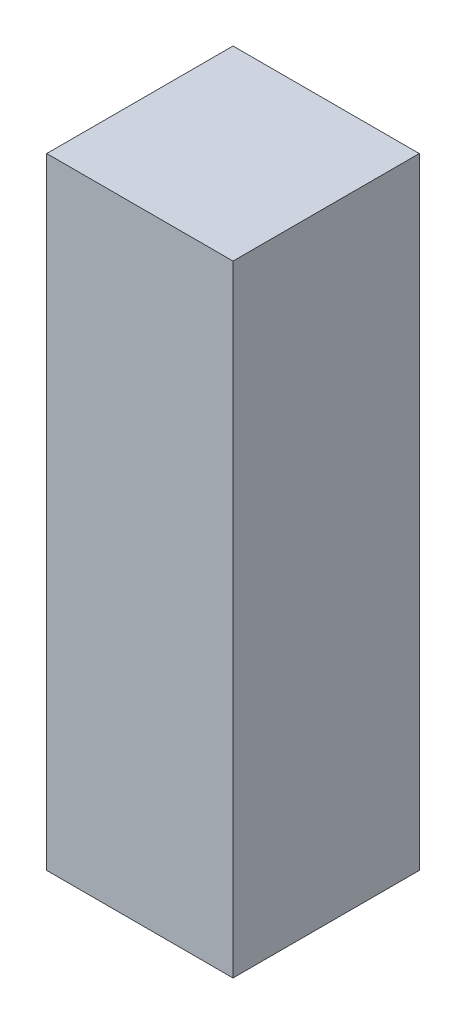
ISO-10303-21;
HEADER;
FILE_DESCRIPTION(('STEP AP214'),'2;1');
FILE_NAME('part.step','',(''),(''),'','','');
FILE_SCHEMA(('AUTOMOTIVE_DESIGN { 1 0 10303 214 1 1 1 1 }'));
ENDSEC;
DATA;
#1=APPLICATION_CONTEXT('core data for automotive mechanical design processes');
#2=APPLICATION_PROTOCOL_DEFINITION('international standard','automotive_design',2000,#1);
#3=PRODUCT_CONTEXT('',#1,'mechanical');
#4=PRODUCT('Part','Part','',(#3));
#5=PRODUCT_RELATED_PRODUCT_CATEGORY('part','',(#4));
#6=PRODUCT_DEFINITION_FORMATION('','',#4);
#7=PRODUCT_DEFINITION_CONTEXT('part definition',#1,'design');
#8=PRODUCT_DEFINITION('design','',#6,#7);
#9=PRODUCT_DEFINITION_SHAPE('','',#8);
#10=(LENGTH_UNIT() NAMED_UNIT(*) SI_UNIT(.MILLI.,.METRE.));
#11=(NAMED_UNIT(*) PLANE_ANGLE_UNIT() SI_UNIT($,.RADIAN.));
#12=(NAMED_UNIT(*) SI_UNIT($,.STERADIAN.) SOLID_ANGLE_UNIT());
#13=UNCERTAINTY_MEASURE_WITH_UNIT(LENGTH_MEASURE(1.E-05),#10,'distance_accuracy_value','');
#14=(GEOMETRIC_REPRESENTATION_CONTEXT(3) GLOBAL_UNCERTAINTY_ASSIGNED_CONTEXT((#13)) GLOBAL_UNIT_ASSIGNED_CONTEXT((#10,
#11,#12)) REPRESENTATION_CONTEXT('',''));
#15=CARTESIAN_POINT('',(0.,0.,0.));
#16=DIRECTION('',(0.,0.,1.));
#17=DIRECTION('',(1.,0.,0.));
#18=AXIS2_PLACEMENT_3D('',#15,#16,#17);
#19=CARTESIAN_POINT('',(-6.,20.,-180.));
#20=DIRECTION('',(-1.,0.,0.));
#21=DIRECTION('',(0.,0.,1.));
#22=AXIS2_PLACEMENT_3D('',#19,#20,#21);
#23=PLANE('',#22);
#24=DIRECTION('',(0.,-1.,0.));
#25=VECTOR('',#24,1.);
#26=CARTESIAN_POINT('',(-6.,20.,-168.));
#27=LINE('',#26,#25);
#28=CARTESIAN_POINT('',(-6.,60.,-168.));
#29=VERTEX_POINT('',#28);
#30=CARTESIAN_POINT('',(-6.,20.,-168.));
#31=VERTEX_POINT('',#30);
#32=EDGE_CURVE('E103',#29,#31,#27,.T.);
#33=ORIENTED_EDGE('',*,*,#32,.F.);
#34=DIRECTION('',(0.,0.,1.));
#35=VECTOR('',#34,1.);
#36=CARTESIAN_POINT('',(-6.,60.,-180.));
#37=LINE('',#36,#35);
#38=CARTESIAN_POINT('',(-6.,60.,-180.));
#39=VERTEX_POINT('',#38);
#40=EDGE_CURVE('E11',#39,#29,#37,.T.);
#41=ORIENTED_EDGE('',*,*,#40,.F.);
#42=DIRECTION('',(0.,-1.,0.));
#43=VECTOR('',#42,1.);
#44=CARTESIAN_POINT('',(-6.,20.,-180.));
#45=LINE('',#44,#43);
#46=CARTESIAN_POINT('',(-6.,20.,-180.));
#47=VERTEX_POINT('',#46);
#48=EDGE_CURVE('E97',#39,#47,#45,.T.);
#49=ORIENTED_EDGE('',*,*,#48,.T.);
#50=DIRECTION('',(0.,0.,1.));
#51=VECTOR('',#50,1.);
#52=CARTESIAN_POINT('',(-6.,20.,-180.));
#53=LINE('',#52,#51);
#54=EDGE_CURVE('E42',#47,#31,#53,.T.);
#55=ORIENTED_EDGE('',*,*,#54,.T.);
#56=EDGE_LOOP('',(#33,#41,#49,#55));
#57=FACE_BOUND('',#56,.T.);
#58=ADVANCED_FACE('F39',(#57),#23,.T.);
#59=CARTESIAN_POINT('',(-6.,60.,-180.));
#60=DIRECTION('',(0.,1.,0.));
#61=DIRECTION('',(0.,0.,1.));
#62=AXIS2_PLACEMENT_3D('',#59,#60,#61);
#63=PLANE('',#62);
#64=DIRECTION('',(-1.,0.,0.));
#65=VECTOR('',#64,1.);
#66=CARTESIAN_POINT('',(-6.,60.,-168.));
#67=LINE('',#66,#65);
#68=CARTESIAN_POINT('',(6.,60.,-168.));
#69=VERTEX_POINT('',#68);
#70=EDGE_CURVE('E99',#69,#29,#67,.T.);
#71=ORIENTED_EDGE('',*,*,#70,.F.);
#72=DIRECTION('',(0.,0.,1.));
#73=VECTOR('',#72,1.);
#74=CARTESIAN_POINT('',(6.,60.,-180.));
#75=LINE('',#74,#73);
#76=CARTESIAN_POINT('',(6.,60.,-180.));
#77=VERTEX_POINT('',#76);
#78=EDGE_CURVE('E48',#77,#69,#75,.T.);
#79=ORIENTED_EDGE('',*,*,#78,.F.);
#80=DIRECTION('',(-1.,0.,0.));
#81=VECTOR('',#80,1.);
#82=CARTESIAN_POINT('',(-6.,60.,-180.));
#83=LINE('',#82,#81);
#84=EDGE_CURVE('E94',#77,#39,#83,.T.);
#85=ORIENTED_EDGE('',*,*,#84,.T.);
#86=ORIENTED_EDGE('',*,*,#40,.T.);
#87=EDGE_LOOP('',(#71,#79,#85,#86));
#88=FACE_BOUND('',#87,.T.);
#89=ADVANCED_FACE('F113',(#88),#63,.T.);
#90=CARTESIAN_POINT('',(6.,20.,-180.));
#91=DIRECTION('',(1.,0.,0.));
#92=DIRECTION('',(0.,0.,-1.));
#93=AXIS2_PLACEMENT_3D('',#90,#91,#92);
#94=PLANE('',#93);
#95=DIRECTION('',(0.,1.,0.));
#96=VECTOR('',#95,1.);
#97=CARTESIAN_POINT('',(6.,20.,-168.));
#98=LINE('',#97,#96);
#99=CARTESIAN_POINT('',(6.,20.,-168.));
#100=VERTEX_POINT('',#99);
#101=EDGE_CURVE('E89',#100,#69,#98,.T.);
#102=ORIENTED_EDGE('',*,*,#101,.F.);
#103=DIRECTION('',(0.,0.,1.));
#104=VECTOR('',#103,1.);
#105=CARTESIAN_POINT('',(6.,20.,-180.));
#106=LINE('',#105,#104);
#107=CARTESIAN_POINT('',(6.,20.,-180.));
#108=VERTEX_POINT('',#107);
#109=EDGE_CURVE('E84',#108,#100,#106,.T.);
#110=ORIENTED_EDGE('',*,*,#109,.F.);
#111=DIRECTION('',(0.,1.,0.));
#112=VECTOR('',#111,1.);
#113=CARTESIAN_POINT('',(6.,20.,-180.));
#114=LINE('',#113,#112);
#115=EDGE_CURVE('E87',#108,#77,#114,.T.);
#116=ORIENTED_EDGE('',*,*,#115,.T.);
#117=ORIENTED_EDGE('',*,*,#78,.T.);
#118=EDGE_LOOP('',(#102,#110,#116,#117));
#119=FACE_BOUND('',#118,.T.);
#120=ADVANCED_FACE('F86',(#119),#94,.T.);
#121=CARTESIAN_POINT('',(-6.,20.,-180.));
#122=DIRECTION('',(0.,-1.,0.));
#123=DIRECTION('',(0.,0.,-1.));
#124=AXIS2_PLACEMENT_3D('',#121,#122,#123);
#125=PLANE('',#124);
#126=DIRECTION('',(1.,0.,0.));
#127=VECTOR('',#126,1.);
#128=CARTESIAN_POINT('',(-6.,20.,-168.));
#129=LINE('',#128,#127);
#130=EDGE_CURVE('E106',#31,#100,#129,.T.);
#131=ORIENTED_EDGE('',*,*,#130,.F.);
#132=ORIENTED_EDGE('',*,*,#54,.F.);
#133=DIRECTION('',(1.,0.,0.));
#134=VECTOR('',#133,1.);
#135=CARTESIAN_POINT('',(-6.,20.,-180.));
#136=LINE('',#135,#134);
#137=EDGE_CURVE('E93',#47,#108,#136,.T.);
#138=ORIENTED_EDGE('',*,*,#137,.T.);
#139=ORIENTED_EDGE('',*,*,#109,.T.);
#140=EDGE_LOOP('',(#131,#132,#138,#139));
#141=FACE_BOUND('',#140,.T.);
#142=ADVANCED_FACE('F96',(#141),#125,.T.);
#143=CARTESIAN_POINT('',(0.,0.,-180.));
#144=DIRECTION('',(0.,0.,-1.));
#145=DIRECTION('',(-1.,0.,0.));
#146=AXIS2_PLACEMENT_3D('',#143,#144,#145);
#147=PLANE('',#146);
#148=ORIENTED_EDGE('',*,*,#48,.F.);
#149=ORIENTED_EDGE('',*,*,#84,.F.);
#150=ORIENTED_EDGE('',*,*,#115,.F.);
#151=ORIENTED_EDGE('',*,*,#137,.F.);
#152=EDGE_LOOP('',(#148,#149,#150,#151));
#153=FACE_BOUND('',#152,.T.);
#154=ADVANCED_FACE('F92',(#153),#147,.T.);
#155=CARTESIAN_POINT('',(0.,0.,-168.));
#156=DIRECTION('',(0.,0.,-1.));
#157=DIRECTION('',(-1.,0.,0.));
#158=AXIS2_PLACEMENT_3D('',#155,#156,#157);
#159=PLANE('',#158);
#160=ORIENTED_EDGE('',*,*,#32,.T.);
#161=ORIENTED_EDGE('',*,*,#130,.T.);
#162=ORIENTED_EDGE('',*,*,#101,.T.);
#163=ORIENTED_EDGE('',*,*,#70,.T.);
#164=EDGE_LOOP('',(#160,#161,#162,#163));
#165=FACE_BOUND('',#164,.T.);
#166=ADVANCED_FACE('F112',(#165),#159,.F.);
#167=CLOSED_SHELL('',(#58,#89,#120,#142,#154,#166));
#168=MANIFOLD_SOLID_BREP('B2',#167);
#169=ADVANCED_BREP_SHAPE_REPRESENTATION('',(#18,#168),#14);
#170=SHAPE_DEFINITION_REPRESENTATION(#9,#169);
ENDSEC;
END-ISO-10303-21;
